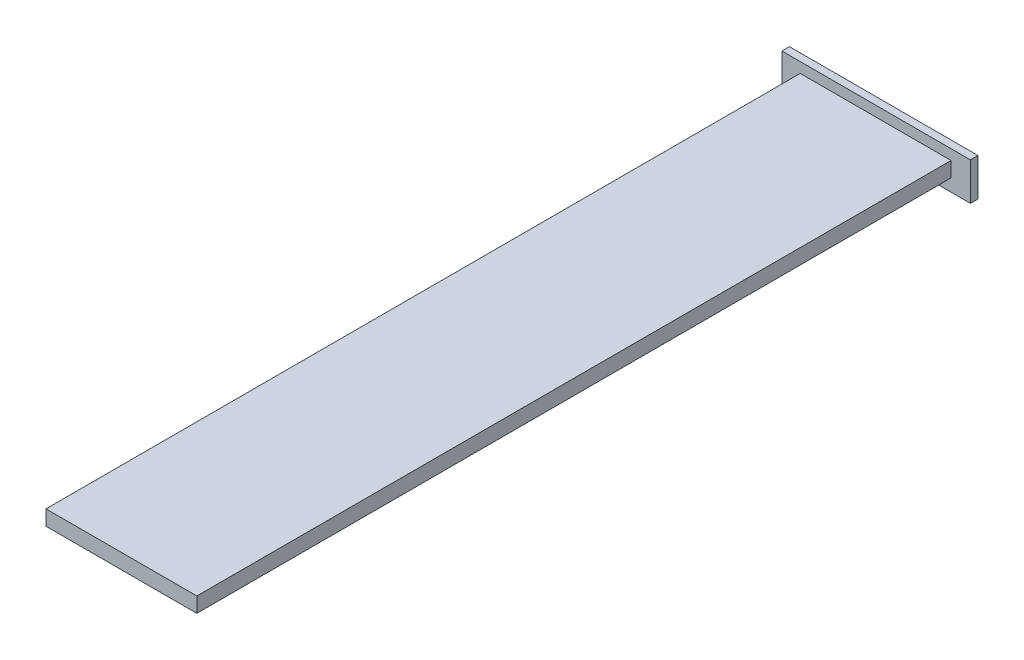
ISO-10303-21;
HEADER;
FILE_DESCRIPTION(('STEP AP214'),'2;1');
FILE_NAME('part.step','',(''),(''),'','','');
FILE_SCHEMA(('AUTOMOTIVE_DESIGN { 1 0 10303 214 1 1 1 1 }'));
ENDSEC;
DATA;
#1=APPLICATION_CONTEXT('core data for automotive mechanical design processes');
#2=APPLICATION_PROTOCOL_DEFINITION('international standard','automotive_design',2000,#1);
#3=PRODUCT_CONTEXT('',#1,'mechanical');
#4=PRODUCT('Part','Part','',(#3));
#5=PRODUCT_RELATED_PRODUCT_CATEGORY('part','',(#4));
#6=PRODUCT_DEFINITION_FORMATION('','',#4);
#7=PRODUCT_DEFINITION_CONTEXT('part definition',#1,'design');
#8=PRODUCT_DEFINITION('design','',#6,#7);
#9=PRODUCT_DEFINITION_SHAPE('','',#8);
#10=(LENGTH_UNIT() NAMED_UNIT(*) SI_UNIT(.MILLI.,.METRE.));
#11=(NAMED_UNIT(*) PLANE_ANGLE_UNIT() SI_UNIT($,.RADIAN.));
#12=(NAMED_UNIT(*) SI_UNIT($,.STERADIAN.) SOLID_ANGLE_UNIT());
#13=UNCERTAINTY_MEASURE_WITH_UNIT(LENGTH_MEASURE(1.E-05),#10,'distance_accuracy_value','');
#14=(GEOMETRIC_REPRESENTATION_CONTEXT(3) GLOBAL_UNCERTAINTY_ASSIGNED_CONTEXT((#13)) GLOBAL_UNIT_ASSIGNED_CONTEXT((#10,
#11,#12)) REPRESENTATION_CONTEXT('',''));
#15=CARTESIAN_POINT('',(0.,0.,0.));
#16=DIRECTION('',(0.,0.,1.));
#17=DIRECTION('',(1.,0.,0.));
#18=AXIS2_PLACEMENT_3D('',#15,#16,#17);
#19=CARTESIAN_POINT('',(0.,0.,10.));
#20=DIRECTION('',(0.,0.,-1.));
#21=DIRECTION('',(-1.,0.,0.));
#22=AXIS2_PLACEMENT_3D('',#19,#20,#21);
#23=PLANE('',#22);
#24=DIRECTION('',(0.,-1.,0.));
#25=VECTOR('',#24,1.);
#26=CARTESIAN_POINT('',(0.,0.,10.));
#27=LINE('',#26,#25);
#28=CARTESIAN_POINT('',(0.,50.,10.));
#29=VERTEX_POINT('',#28);
#30=CARTESIAN_POINT('',(0.,0.,10.));
#31=VERTEX_POINT('',#30);
#32=EDGE_CURVE('E152',#29,#31,#27,.T.);
#33=ORIENTED_EDGE('',*,*,#32,.T.);
#34=DIRECTION('',(1.,0.,0.));
#35=VECTOR('',#34,1.);
#36=CARTESIAN_POINT('',(0.,0.,10.));
#37=LINE('',#36,#35);
#38=CARTESIAN_POINT('',(250.,0.,10.));
#39=VERTEX_POINT('',#38);
#40=EDGE_CURVE('E157',#31,#39,#37,.T.);
#41=ORIENTED_EDGE('',*,*,#40,.T.);
#42=DIRECTION('',(0.,1.,0.));
#43=VECTOR('',#42,1.);
#44=CARTESIAN_POINT('',(250.,0.,10.));
#45=LINE('',#44,#43);
#46=CARTESIAN_POINT('',(250.,50.,10.));
#47=VERTEX_POINT('',#46);
#48=EDGE_CURVE('E161',#39,#47,#45,.T.);
#49=ORIENTED_EDGE('',*,*,#48,.T.);
#50=DIRECTION('',(-1.,0.,0.));
#51=VECTOR('',#50,1.);
#52=CARTESIAN_POINT('',(0.,50.,10.));
#53=LINE('',#52,#51);
#54=EDGE_CURVE('E164',#47,#29,#53,.T.);
#55=ORIENTED_EDGE('',*,*,#54,.T.);
#56=EDGE_LOOP('',(#33,#41,#49,#55));
#57=FACE_BOUND('',#56,.T.);
#58=DIRECTION('',(0.,1.,0.));
#59=VECTOR('',#58,1.);
#60=CARTESIAN_POINT('',(224.28785998787,36.4076477071313,10.));
#61=LINE('',#60,#59);
#62=CARTESIAN_POINT('',(224.28785998787,16.4076477071313,10.));
#63=VERTEX_POINT('',#62);
#64=CARTESIAN_POINT('',(224.28785998787,36.4076477071313,10.));
#65=VERTEX_POINT('',#64);
#66=EDGE_CURVE('E68',#63,#65,#61,.T.);
#67=ORIENTED_EDGE('',*,*,#66,.F.);
#68=DIRECTION('',(1.,0.,0.));
#69=VECTOR('',#68,1.);
#70=CARTESIAN_POINT('',(24.2878599878704,16.4076477071313,10.));
#71=LINE('',#70,#69);
#72=CARTESIAN_POINT('',(24.2878599878704,16.4076477071313,10.));
#73=VERTEX_POINT('',#72);
#74=EDGE_CURVE('E72',#73,#63,#71,.T.);
#75=ORIENTED_EDGE('',*,*,#74,.F.);
#76=DIRECTION('',(0.,-1.,0.));
#77=VECTOR('',#76,1.);
#78=CARTESIAN_POINT('',(24.2878599878704,36.4076477071313,10.));
#79=LINE('',#78,#77);
#80=CARTESIAN_POINT('',(24.2878599878704,36.4076477071313,10.));
#81=VERTEX_POINT('',#80);
#82=EDGE_CURVE('E186',#81,#73,#79,.T.);
#83=ORIENTED_EDGE('',*,*,#82,.F.);
#84=DIRECTION('',(-1.,0.,0.));
#85=VECTOR('',#84,1.);
#86=CARTESIAN_POINT('',(24.2878599878704,36.4076477071313,10.));
#87=LINE('',#86,#85);
#88=EDGE_CURVE('E189',#65,#81,#87,.T.);
#89=ORIENTED_EDGE('',*,*,#88,.F.);
#90=EDGE_LOOP('',(#67,#75,#83,#89));
#91=FACE_BOUND('',#90,.T.);
#92=ADVANCED_FACE('F52',(#57,#91),#23,.F.);
#93=CARTESIAN_POINT('',(0.,0.,10.));
#94=DIRECTION('',(1.,0.,0.));
#95=DIRECTION('',(0.,0.,-1.));
#96=AXIS2_PLACEMENT_3D('',#93,#94,#95);
#97=PLANE('',#96);
#98=DIRECTION('',(0.,-1.,0.));
#99=VECTOR('',#98,1.);
#100=CARTESIAN_POINT('',(0.,0.,0.));
#101=LINE('',#100,#99);
#102=CARTESIAN_POINT('',(0.,50.,0.));
#103=VERTEX_POINT('',#102);
#104=CARTESIAN_POINT('',(0.,0.,0.));
#105=VERTEX_POINT('',#104);
#106=EDGE_CURVE('E141',#103,#105,#101,.T.);
#107=ORIENTED_EDGE('',*,*,#106,.T.);
#108=DIRECTION('',(0.,0.,-1.));
#109=VECTOR('',#108,1.);
#110=CARTESIAN_POINT('',(0.,0.,10.));
#111=LINE('',#110,#109);
#112=EDGE_CURVE('E12',#31,#105,#111,.T.);
#113=ORIENTED_EDGE('',*,*,#112,.F.);
#114=ORIENTED_EDGE('',*,*,#32,.F.);
#115=DIRECTION('',(0.,0.,-1.));
#116=VECTOR('',#115,1.);
#117=CARTESIAN_POINT('',(0.,50.,10.));
#118=LINE('',#117,#116);
#119=EDGE_CURVE('E166',#29,#103,#118,.T.);
#120=ORIENTED_EDGE('',*,*,#119,.T.);
#121=EDGE_LOOP('',(#107,#113,#114,#120));
#122=FACE_BOUND('',#121,.T.);
#123=ADVANCED_FACE('F54',(#122),#97,.F.);
#124=CARTESIAN_POINT('',(0.,0.,10.));
#125=DIRECTION('',(0.,1.,0.));
#126=DIRECTION('',(0.,0.,1.));
#127=AXIS2_PLACEMENT_3D('',#124,#125,#126);
#128=PLANE('',#127);
#129=DIRECTION('',(1.,0.,0.));
#130=VECTOR('',#129,1.);
#131=CARTESIAN_POINT('',(0.,0.,0.));
#132=LINE('',#131,#130);
#133=CARTESIAN_POINT('',(250.,0.,0.));
#134=VERTEX_POINT('',#133);
#135=EDGE_CURVE('E146',#105,#134,#132,.T.);
#136=ORIENTED_EDGE('',*,*,#135,.T.);
#137=DIRECTION('',(0.,0.,-1.));
#138=VECTOR('',#137,1.);
#139=CARTESIAN_POINT('',(250.,0.,10.));
#140=LINE('',#139,#138);
#141=EDGE_CURVE('E61',#39,#134,#140,.T.);
#142=ORIENTED_EDGE('',*,*,#141,.F.);
#143=ORIENTED_EDGE('',*,*,#40,.F.);
#144=ORIENTED_EDGE('',*,*,#112,.T.);
#145=EDGE_LOOP('',(#136,#142,#143,#144));
#146=FACE_BOUND('',#145,.T.);
#147=ADVANCED_FACE('F218',(#146),#128,.F.);
#148=CARTESIAN_POINT('',(250.,0.,10.));
#149=DIRECTION('',(-1.,0.,0.));
#150=DIRECTION('',(0.,0.,1.));
#151=AXIS2_PLACEMENT_3D('',#148,#149,#150);
#152=PLANE('',#151);
#153=DIRECTION('',(0.,1.,0.));
#154=VECTOR('',#153,1.);
#155=CARTESIAN_POINT('',(250.,0.,0.));
#156=LINE('',#155,#154);
#157=CARTESIAN_POINT('',(250.,50.,0.));
#158=VERTEX_POINT('',#157);
#159=EDGE_CURVE('E171',#134,#158,#156,.T.);
#160=ORIENTED_EDGE('',*,*,#159,.T.);
#161=DIRECTION('',(0.,0.,-1.));
#162=VECTOR('',#161,1.);
#163=CARTESIAN_POINT('',(250.,50.,10.));
#164=LINE('',#163,#162);
#165=EDGE_CURVE('E247',#47,#158,#164,.T.);
#166=ORIENTED_EDGE('',*,*,#165,.F.);
#167=ORIENTED_EDGE('',*,*,#48,.F.);
#168=ORIENTED_EDGE('',*,*,#141,.T.);
#169=EDGE_LOOP('',(#160,#166,#167,#168));
#170=FACE_BOUND('',#169,.T.);
#171=ADVANCED_FACE('F230',(#170),#152,.F.);
#172=CARTESIAN_POINT('',(0.,50.,10.));
#173=DIRECTION('',(0.,-1.,0.));
#174=DIRECTION('',(0.,0.,-1.));
#175=AXIS2_PLACEMENT_3D('',#172,#173,#174);
#176=PLANE('',#175);
#177=DIRECTION('',(-1.,0.,0.));
#178=VECTOR('',#177,1.);
#179=CARTESIAN_POINT('',(0.,50.,0.));
#180=LINE('',#179,#178);
#181=EDGE_CURVE('E158',#158,#103,#180,.T.);
#182=ORIENTED_EDGE('',*,*,#181,.T.);
#183=ORIENTED_EDGE('',*,*,#119,.F.);
#184=ORIENTED_EDGE('',*,*,#54,.F.);
#185=ORIENTED_EDGE('',*,*,#165,.T.);
#186=EDGE_LOOP('',(#182,#183,#184,#185));
#187=FACE_BOUND('',#186,.T.);
#188=ADVANCED_FACE('F226',(#187),#176,.F.);
#189=CARTESIAN_POINT('',(0.,0.,0.));
#190=DIRECTION('',(0.,0.,-1.));
#191=DIRECTION('',(-1.,0.,0.));
#192=AXIS2_PLACEMENT_3D('',#189,#190,#191);
#193=PLANE('',#192);
#194=ORIENTED_EDGE('',*,*,#106,.F.);
#195=ORIENTED_EDGE('',*,*,#181,.F.);
#196=ORIENTED_EDGE('',*,*,#159,.F.);
#197=ORIENTED_EDGE('',*,*,#135,.F.);
#198=EDGE_LOOP('',(#194,#195,#196,#197));
#199=FACE_BOUND('',#198,.T.);
#200=ADVANCED_FACE('F223',(#199),#193,.T.);
#201=CARTESIAN_POINT('',(224.28785998787,36.4076477071313,1010.));
#202=DIRECTION('',(-1.,0.,0.));
#203=DIRECTION('',(0.,0.,1.));
#204=AXIS2_PLACEMENT_3D('',#201,#202,#203);
#205=PLANE('',#204);
#206=ORIENTED_EDGE('',*,*,#66,.T.);
#207=DIRECTION('',(0.,0.,-1.));
#208=VECTOR('',#207,1.);
#209=CARTESIAN_POINT('',(224.28785998787,36.4076477071313,1010.));
#210=LINE('',#209,#208);
#211=CARTESIAN_POINT('',(224.28785998787,36.4076477071313,1010.));
#212=VERTEX_POINT('',#211);
#213=EDGE_CURVE('E121',#212,#65,#210,.T.);
#214=ORIENTED_EDGE('',*,*,#213,.F.);
#215=DIRECTION('',(0.,1.,0.));
#216=VECTOR('',#215,1.);
#217=CARTESIAN_POINT('',(224.28785998787,36.4076477071313,1010.));
#218=LINE('',#217,#216);
#219=CARTESIAN_POINT('',(224.28785998787,16.4076477071313,1010.));
#220=VERTEX_POINT('',#219);
#221=EDGE_CURVE('E128',#220,#212,#218,.T.);
#222=ORIENTED_EDGE('',*,*,#221,.F.);
#223=DIRECTION('',(0.,0.,-1.));
#224=VECTOR('',#223,1.);
#225=CARTESIAN_POINT('',(224.28785998787,16.4076477071313,1010.));
#226=LINE('',#225,#224);
#227=EDGE_CURVE('E181',#220,#63,#226,.T.);
#228=ORIENTED_EDGE('',*,*,#227,.T.);
#229=EDGE_LOOP('',(#206,#214,#222,#228));
#230=FACE_BOUND('',#229,.T.);
#231=ADVANCED_FACE('F139',(#230),#205,.F.);
#232=CARTESIAN_POINT('',(24.2878599878704,36.4076477071313,1010.));
#233=DIRECTION('',(0.,-1.,0.));
#234=DIRECTION('',(1.,0.,0.));
#235=AXIS2_PLACEMENT_3D('',#232,#233,#234);
#236=PLANE('',#235);
#237=ORIENTED_EDGE('',*,*,#88,.T.);
#238=DIRECTION('',(0.,0.,-1.));
#239=VECTOR('',#238,1.);
#240=CARTESIAN_POINT('',(24.2878599878704,36.4076477071313,1010.));
#241=LINE('',#240,#239);
#242=CARTESIAN_POINT('',(24.2878599878704,36.4076477071313,1010.));
#243=VERTEX_POINT('',#242);
#244=EDGE_CURVE('E123',#243,#81,#241,.T.);
#245=ORIENTED_EDGE('',*,*,#244,.F.);
#246=DIRECTION('',(-1.,0.,0.));
#247=VECTOR('',#246,1.);
#248=CARTESIAN_POINT('',(24.2878599878704,36.4076477071313,1010.));
#249=LINE('',#248,#247);
#250=EDGE_CURVE('E116',#212,#243,#249,.T.);
#251=ORIENTED_EDGE('',*,*,#250,.F.);
#252=ORIENTED_EDGE('',*,*,#213,.T.);
#253=EDGE_LOOP('',(#237,#245,#251,#252));
#254=FACE_BOUND('',#253,.T.);
#255=ADVANCED_FACE('F119',(#254),#236,.F.);
#256=CARTESIAN_POINT('',(24.2878599878704,36.4076477071313,1010.));
#257=DIRECTION('',(1.,0.,0.));
#258=DIRECTION('',(0.,0.,-1.));
#259=AXIS2_PLACEMENT_3D('',#256,#257,#258);
#260=PLANE('',#259);
#261=ORIENTED_EDGE('',*,*,#82,.T.);
#262=DIRECTION('',(0.,0.,-1.));
#263=VECTOR('',#262,1.);
#264=CARTESIAN_POINT('',(24.2878599878704,16.4076477071313,1010.));
#265=LINE('',#264,#263);
#266=CARTESIAN_POINT('',(24.2878599878704,16.4076477071313,1010.));
#267=VERTEX_POINT('',#266);
#268=EDGE_CURVE('E148',#267,#73,#265,.T.);
#269=ORIENTED_EDGE('',*,*,#268,.F.);
#270=DIRECTION('',(0.,-1.,0.));
#271=VECTOR('',#270,1.);
#272=CARTESIAN_POINT('',(24.2878599878704,36.4076477071313,1010.));
#273=LINE('',#272,#271);
#274=EDGE_CURVE('E127',#243,#267,#273,.T.);
#275=ORIENTED_EDGE('',*,*,#274,.F.);
#276=ORIENTED_EDGE('',*,*,#244,.T.);
#277=EDGE_LOOP('',(#261,#269,#275,#276));
#278=FACE_BOUND('',#277,.T.);
#279=ADVANCED_FACE('F201',(#278),#260,.F.);
#280=CARTESIAN_POINT('',(24.2878599878704,16.4076477071313,1010.));
#281=DIRECTION('',(0.,1.,0.));
#282=DIRECTION('',(0.,0.,1.));
#283=AXIS2_PLACEMENT_3D('',#280,#281,#282);
#284=PLANE('',#283);
#285=ORIENTED_EDGE('',*,*,#74,.T.);
#286=ORIENTED_EDGE('',*,*,#227,.F.);
#287=DIRECTION('',(1.,0.,0.));
#288=VECTOR('',#287,1.);
#289=CARTESIAN_POINT('',(24.2878599878704,16.4076477071313,1010.));
#290=LINE('',#289,#288);
#291=EDGE_CURVE('E133',#267,#220,#290,.T.);
#292=ORIENTED_EDGE('',*,*,#291,.F.);
#293=ORIENTED_EDGE('',*,*,#268,.T.);
#294=EDGE_LOOP('',(#285,#286,#292,#293));
#295=FACE_BOUND('',#294,.T.);
#296=ADVANCED_FACE('F203',(#295),#284,.F.);
#297=CARTESIAN_POINT('',(0.,0.,1010.));
#298=DIRECTION('',(0.,0.,1.));
#299=DIRECTION('',(1.,0.,0.));
#300=AXIS2_PLACEMENT_3D('',#297,#298,#299);
#301=PLANE('',#300);
#302=ORIENTED_EDGE('',*,*,#221,.T.);
#303=ORIENTED_EDGE('',*,*,#250,.T.);
#304=ORIENTED_EDGE('',*,*,#274,.T.);
#305=ORIENTED_EDGE('',*,*,#291,.T.);
#306=EDGE_LOOP('',(#302,#303,#304,#305));
#307=FACE_BOUND('',#306,.T.);
#308=ADVANCED_FACE('F131',(#307),#301,.T.);
#309=CLOSED_SHELL('',(#92,#123,#147,#171,#188,#200,#231,#255,#279,#296,#308));
#310=MANIFOLD_SOLID_BREP('B2',#309);
#311=ADVANCED_BREP_SHAPE_REPRESENTATION('',(#18,#310),#14);
#312=SHAPE_DEFINITION_REPRESENTATION(#9,#311);
ENDSEC;
END-ISO-10303-21;
